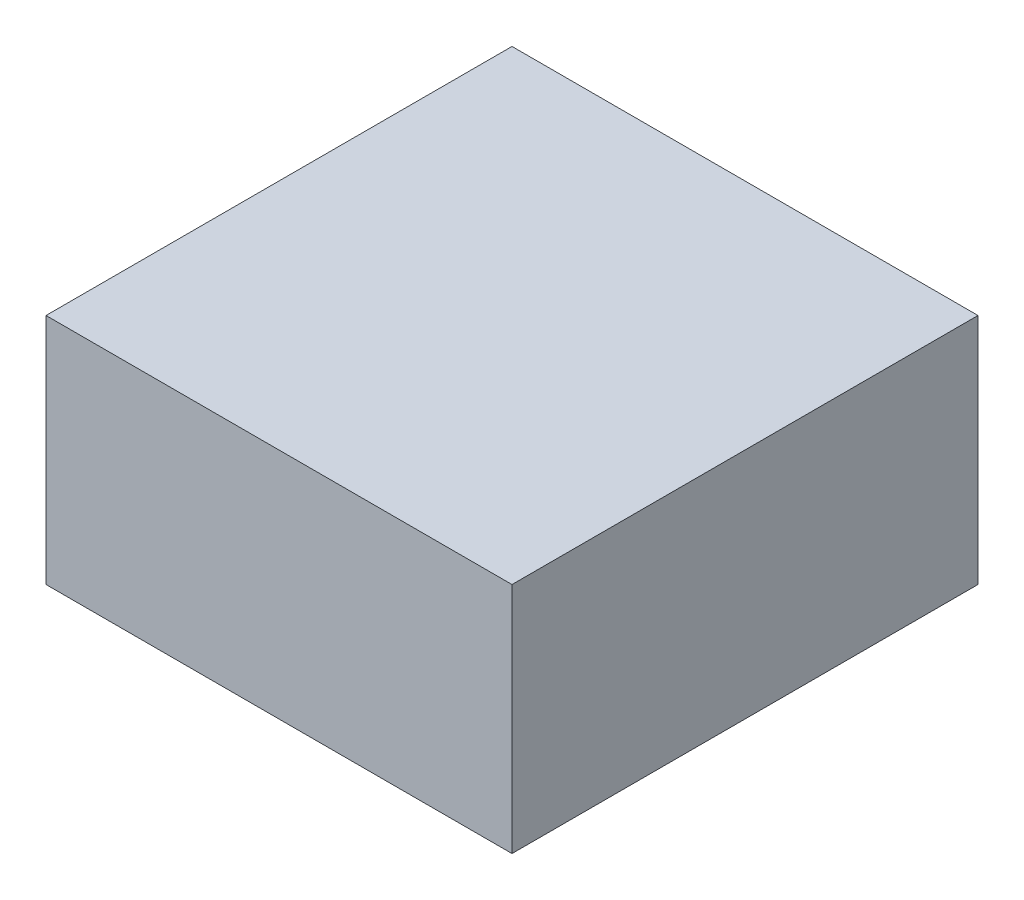
ISO-10303-21;
HEADER;
FILE_DESCRIPTION(('STEP AP214'),'2;1');
FILE_NAME('part.step','',(''),(''),'','','');
FILE_SCHEMA(('AUTOMOTIVE_DESIGN { 1 0 10303 214 1 1 1 1 }'));
ENDSEC;
DATA;
#1=APPLICATION_CONTEXT('core data for automotive mechanical design processes');
#2=APPLICATION_PROTOCOL_DEFINITION('international standard','automotive_design',2000,#1);
#3=PRODUCT_CONTEXT('',#1,'mechanical');
#4=PRODUCT('Part','Part','',(#3));
#5=PRODUCT_RELATED_PRODUCT_CATEGORY('part','',(#4));
#6=PRODUCT_DEFINITION_FORMATION('','',#4);
#7=PRODUCT_DEFINITION_CONTEXT('part definition',#1,'design');
#8=PRODUCT_DEFINITION('design','',#6,#7);
#9=PRODUCT_DEFINITION_SHAPE('','',#8);
#10=(LENGTH_UNIT() NAMED_UNIT(*) SI_UNIT(.MILLI.,.METRE.));
#11=(NAMED_UNIT(*) PLANE_ANGLE_UNIT() SI_UNIT($,.RADIAN.));
#12=(NAMED_UNIT(*) SI_UNIT($,.STERADIAN.) SOLID_ANGLE_UNIT());
#13=UNCERTAINTY_MEASURE_WITH_UNIT(LENGTH_MEASURE(1.E-05),#10,'distance_accuracy_value','');
#14=(GEOMETRIC_REPRESENTATION_CONTEXT(3) GLOBAL_UNCERTAINTY_ASSIGNED_CONTEXT((#13)) GLOBAL_UNIT_ASSIGNED_CONTEXT((#10,
#11,#12)) REPRESENTATION_CONTEXT('',''));
#15=CARTESIAN_POINT('',(0.,0.,0.));
#16=DIRECTION('',(0.,0.,1.));
#17=DIRECTION('',(1.,0.,0.));
#18=AXIS2_PLACEMENT_3D('',#15,#16,#17);
#19=CARTESIAN_POINT('',(6.35,6.35,6.35));
#20=DIRECTION('',(-1.,0.,0.));
#21=DIRECTION('',(0.,0.,1.));
#22=AXIS2_PLACEMENT_3D('',#19,#20,#21);
#23=PLANE('',#22);
#24=DIRECTION('',(0.,0.,-1.));
#25=VECTOR('',#24,1.);
#26=CARTESIAN_POINT('',(6.35,0.,6.35));
#27=LINE('',#26,#25);
#28=CARTESIAN_POINT('',(6.35,0.,6.35));
#29=VERTEX_POINT('',#28);
#30=CARTESIAN_POINT('',(6.35,0.,-6.35));
#31=VERTEX_POINT('',#30);
#32=EDGE_CURVE('E96',#29,#31,#27,.T.);
#33=ORIENTED_EDGE('',*,*,#32,.T.);
#34=DIRECTION('',(0.,-1.,0.));
#35=VECTOR('',#34,1.);
#36=CARTESIAN_POINT('',(6.35,6.35,-6.35));
#37=LINE('',#36,#35);
#38=CARTESIAN_POINT('',(6.35,6.35,-6.35));
#39=VERTEX_POINT('',#38);
#40=EDGE_CURVE('E11',#39,#31,#37,.T.);
#41=ORIENTED_EDGE('',*,*,#40,.F.);
#42=DIRECTION('',(0.,0.,-1.));
#43=VECTOR('',#42,1.);
#44=CARTESIAN_POINT('',(6.35,6.35,6.35));
#45=LINE('',#44,#43);
#46=CARTESIAN_POINT('',(6.35,6.35,6.35));
#47=VERTEX_POINT('',#46);
#48=EDGE_CURVE('E84',#47,#39,#45,.T.);
#49=ORIENTED_EDGE('',*,*,#48,.F.);
#50=DIRECTION('',(0.,-1.,0.));
#51=VECTOR('',#50,1.);
#52=CARTESIAN_POINT('',(6.35,6.35,6.35));
#53=LINE('',#52,#51);
#54=EDGE_CURVE('E92',#47,#29,#53,.T.);
#55=ORIENTED_EDGE('',*,*,#54,.T.);
#56=EDGE_LOOP('',(#33,#41,#49,#55));
#57=FACE_BOUND('',#56,.T.);
#58=ADVANCED_FACE('F33',(#57),#23,.F.);
#59=CARTESIAN_POINT('',(-6.35,6.35,-6.35));
#60=DIRECTION('',(0.,0.,1.));
#61=DIRECTION('',(1.,0.,0.));
#62=AXIS2_PLACEMENT_3D('',#59,#60,#61);
#63=PLANE('',#62);
#64=DIRECTION('',(-1.,0.,0.));
#65=VECTOR('',#64,1.);
#66=CARTESIAN_POINT('',(-6.35,0.,-6.35));
#67=LINE('',#66,#65);
#68=CARTESIAN_POINT('',(-6.35,0.,-6.35));
#69=VERTEX_POINT('',#68);
#70=EDGE_CURVE('E88',#31,#69,#67,.T.);
#71=ORIENTED_EDGE('',*,*,#70,.T.);
#72=DIRECTION('',(0.,-1.,0.));
#73=VECTOR('',#72,1.);
#74=CARTESIAN_POINT('',(-6.35,6.35,-6.35));
#75=LINE('',#74,#73);
#76=CARTESIAN_POINT('',(-6.35,6.35,-6.35));
#77=VERTEX_POINT('',#76);
#78=EDGE_CURVE('E41',#77,#69,#75,.T.);
#79=ORIENTED_EDGE('',*,*,#78,.F.);
#80=DIRECTION('',(-1.,0.,0.));
#81=VECTOR('',#80,1.);
#82=CARTESIAN_POINT('',(-6.35,6.35,-6.35));
#83=LINE('',#82,#81);
#84=EDGE_CURVE('E79',#39,#77,#83,.T.);
#85=ORIENTED_EDGE('',*,*,#84,.F.);
#86=ORIENTED_EDGE('',*,*,#40,.T.);
#87=EDGE_LOOP('',(#71,#79,#85,#86));
#88=FACE_BOUND('',#87,.T.);
#89=ADVANCED_FACE('F87',(#88),#63,.F.);
#90=CARTESIAN_POINT('',(-6.35,6.35,6.35));
#91=DIRECTION('',(1.,0.,0.));
#92=DIRECTION('',(0.,0.,-1.));
#93=AXIS2_PLACEMENT_3D('',#90,#91,#92);
#94=PLANE('',#93);
#95=DIRECTION('',(0.,0.,1.));
#96=VECTOR('',#95,1.);
#97=CARTESIAN_POINT('',(-6.35,0.,6.35));
#98=LINE('',#97,#96);
#99=CARTESIAN_POINT('',(-6.35,0.,6.35));
#100=VERTEX_POINT('',#99);
#101=EDGE_CURVE('E66',#69,#100,#98,.T.);
#102=ORIENTED_EDGE('',*,*,#101,.T.);
#103=DIRECTION('',(0.,-1.,0.));
#104=VECTOR('',#103,1.);
#105=CARTESIAN_POINT('',(-6.35,6.35,6.35));
#106=LINE('',#105,#104);
#107=CARTESIAN_POINT('',(-6.35,6.35,6.35));
#108=VERTEX_POINT('',#107);
#109=EDGE_CURVE('E89',#108,#100,#106,.T.);
#110=ORIENTED_EDGE('',*,*,#109,.F.);
#111=DIRECTION('',(0.,0.,1.));
#112=VECTOR('',#111,1.);
#113=CARTESIAN_POINT('',(-6.35,6.35,6.35));
#114=LINE('',#113,#112);
#115=EDGE_CURVE('E82',#77,#108,#114,.T.);
#116=ORIENTED_EDGE('',*,*,#115,.F.);
#117=ORIENTED_EDGE('',*,*,#78,.T.);
#118=EDGE_LOOP('',(#102,#110,#116,#117));
#119=FACE_BOUND('',#118,.T.);
#120=ADVANCED_FACE('F90',(#119),#94,.F.);
#121=CARTESIAN_POINT('',(-6.35,6.35,6.35));
#122=DIRECTION('',(0.,0.,-1.));
#123=DIRECTION('',(-1.,0.,0.));
#124=AXIS2_PLACEMENT_3D('',#121,#122,#123);
#125=PLANE('',#124);
#126=DIRECTION('',(1.,0.,0.));
#127=VECTOR('',#126,1.);
#128=CARTESIAN_POINT('',(-6.35,0.,6.35));
#129=LINE('',#128,#127);
#130=EDGE_CURVE('E72',#100,#29,#129,.T.);
#131=ORIENTED_EDGE('',*,*,#130,.T.);
#132=ORIENTED_EDGE('',*,*,#54,.F.);
#133=DIRECTION('',(1.,0.,0.));
#134=VECTOR('',#133,1.);
#135=CARTESIAN_POINT('',(-6.35,6.35,6.35));
#136=LINE('',#135,#134);
#137=EDGE_CURVE('E49',#108,#47,#136,.T.);
#138=ORIENTED_EDGE('',*,*,#137,.F.);
#139=ORIENTED_EDGE('',*,*,#109,.T.);
#140=EDGE_LOOP('',(#131,#132,#138,#139));
#141=FACE_BOUND('',#140,.T.);
#142=ADVANCED_FACE('F103',(#141),#125,.F.);
#143=CARTESIAN_POINT('',(0.,6.35,0.));
#144=DIRECTION('',(0.,-1.,0.));
#145=DIRECTION('',(0.,0.,-1.));
#146=AXIS2_PLACEMENT_3D('',#143,#144,#145);
#147=PLANE('',#146);
#148=ORIENTED_EDGE('',*,*,#48,.T.);
#149=ORIENTED_EDGE('',*,*,#84,.T.);
#150=ORIENTED_EDGE('',*,*,#115,.T.);
#151=ORIENTED_EDGE('',*,*,#137,.T.);
#152=EDGE_LOOP('',(#148,#149,#150,#151));
#153=FACE_BOUND('',#152,.T.);
#154=ADVANCED_FACE('F80',(#153),#147,.F.);
#155=CARTESIAN_POINT('',(0.,0.,0.));
#156=DIRECTION('',(0.,-1.,0.));
#157=DIRECTION('',(0.,0.,-1.));
#158=AXIS2_PLACEMENT_3D('',#155,#156,#157);
#159=PLANE('',#158);
#160=ORIENTED_EDGE('',*,*,#32,.F.);
#161=ORIENTED_EDGE('',*,*,#130,.F.);
#162=ORIENTED_EDGE('',*,*,#101,.F.);
#163=ORIENTED_EDGE('',*,*,#70,.F.);
#164=EDGE_LOOP('',(#160,#161,#162,#163));
#165=FACE_BOUND('',#164,.T.);
#166=ADVANCED_FACE('F106',(#165),#159,.T.);
#167=CLOSED_SHELL('',(#58,#89,#120,#142,#154,#166));
#168=MANIFOLD_SOLID_BREP('B2',#167);
#169=ADVANCED_BREP_SHAPE_REPRESENTATION('',(#18,#168),#14);
#170=SHAPE_DEFINITION_REPRESENTATION(#9,#169);
ENDSEC;
END-ISO-10303-21;
